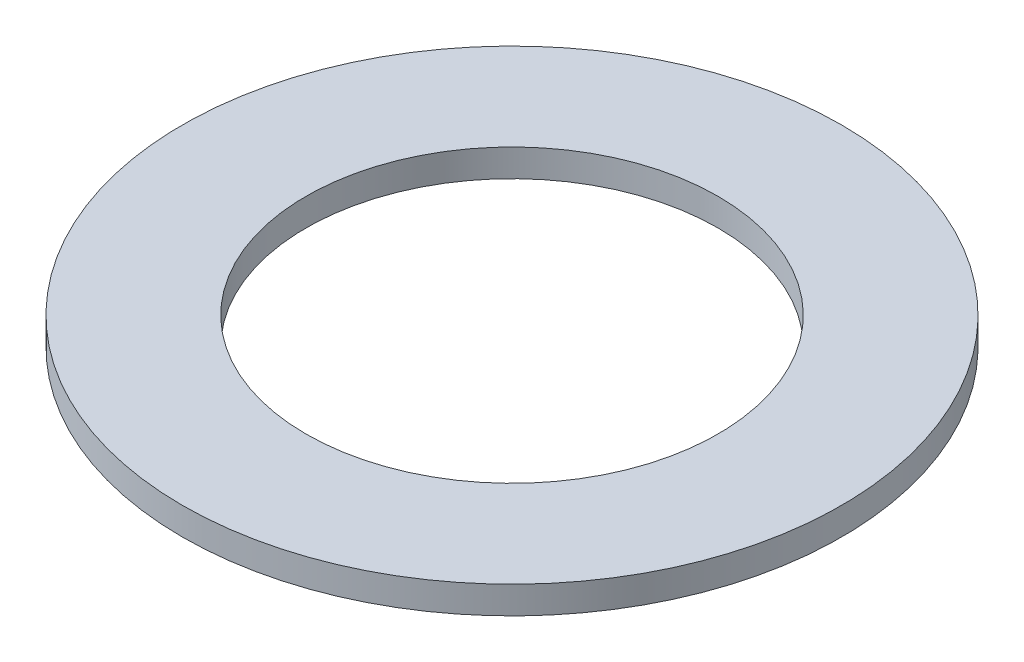
ISO-10303-21;
HEADER;
FILE_DESCRIPTION(('STEP AP214'),'2;1');
FILE_NAME('part.step','',(''),(''),'','','');
FILE_SCHEMA(('AUTOMOTIVE_DESIGN { 1 0 10303 214 1 1 1 1 }'));
ENDSEC;
DATA;
#1=APPLICATION_CONTEXT('core data for automotive mechanical design processes');
#2=APPLICATION_PROTOCOL_DEFINITION('international standard','automotive_design',2000,#1);
#3=PRODUCT_CONTEXT('',#1,'mechanical');
#4=PRODUCT('Part','Part','',(#3));
#5=PRODUCT_RELATED_PRODUCT_CATEGORY('part','',(#4));
#6=PRODUCT_DEFINITION_FORMATION('','',#4);
#7=PRODUCT_DEFINITION_CONTEXT('part definition',#1,'design');
#8=PRODUCT_DEFINITION('design','',#6,#7);
#9=PRODUCT_DEFINITION_SHAPE('','',#8);
#10=(LENGTH_UNIT() NAMED_UNIT(*) SI_UNIT(.MILLI.,.METRE.));
#11=(NAMED_UNIT(*) PLANE_ANGLE_UNIT() SI_UNIT($,.RADIAN.));
#12=(NAMED_UNIT(*) SI_UNIT($,.STERADIAN.) SOLID_ANGLE_UNIT());
#13=UNCERTAINTY_MEASURE_WITH_UNIT(LENGTH_MEASURE(1.E-05),#10,'distance_accuracy_value','');
#14=(GEOMETRIC_REPRESENTATION_CONTEXT(3) GLOBAL_UNCERTAINTY_ASSIGNED_CONTEXT((#13)) GLOBAL_UNIT_ASSIGNED_CONTEXT((#10,
#11,#12)) REPRESENTATION_CONTEXT('',''));
#15=CARTESIAN_POINT('',(0.,0.,0.));
#16=DIRECTION('',(0.,0.,1.));
#17=DIRECTION('',(1.,0.,0.));
#18=AXIS2_PLACEMENT_3D('',#15,#16,#17);
#19=CARTESIAN_POINT('',(0.,0.5,0.));
#20=DIRECTION('',(0.,1.,0.));
#21=DIRECTION('',(0.,0.,1.));
#22=AXIS2_PLACEMENT_3D('',#19,#20,#21);
#23=PLANE('',#22);
#24=CARTESIAN_POINT('',(0.,0.5,0.));
#25=DIRECTION('',(0.,1.,0.));
#26=DIRECTION('',(0.,0.,1.));
#27=AXIS2_PLACEMENT_3D('',#24,#25,#26);
#28=CIRCLE('',#27,6.);
#29=CARTESIAN_POINT('',(0.,0.5,6.));
#30=VERTEX_POINT('',#29);
#31=EDGE_CURVE('E10',#30,#30,#28,.T.);
#32=ORIENTED_EDGE('',*,*,#31,.T.);
#33=EDGE_LOOP('',(#32));
#34=FACE_BOUND('',#33,.T.);
#35=CARTESIAN_POINT('',(0.,0.5,0.));
#36=DIRECTION('',(0.,1.,0.));
#37=DIRECTION('',(0.,0.,1.));
#38=AXIS2_PLACEMENT_3D('',#35,#36,#37);
#39=CIRCLE('',#38,3.75);
#40=CARTESIAN_POINT('',(0.,0.5,3.75));
#41=VERTEX_POINT('',#40);
#42=EDGE_CURVE('E43',#41,#41,#39,.T.);
#43=ORIENTED_EDGE('',*,*,#42,.F.);
#44=EDGE_LOOP('',(#43));
#45=FACE_BOUND('',#44,.T.);
#46=ADVANCED_FACE('F32',(#34,#45),#23,.T.);
#47=CARTESIAN_POINT('',(0.,0.,0.));
#48=DIRECTION('',(0.,1.,0.));
#49=DIRECTION('',(0.,0.,1.));
#50=AXIS2_PLACEMENT_3D('',#47,#48,#49);
#51=PLANE('',#50);
#52=CARTESIAN_POINT('',(0.,0.,0.));
#53=DIRECTION('',(0.,1.,0.));
#54=DIRECTION('',(0.,0.,1.));
#55=AXIS2_PLACEMENT_3D('',#52,#53,#54);
#56=CIRCLE('',#55,6.);
#57=CARTESIAN_POINT('',(0.,0.,6.));
#58=VERTEX_POINT('',#57);
#59=EDGE_CURVE('E36',#58,#58,#56,.T.);
#60=ORIENTED_EDGE('',*,*,#59,.F.);
#61=EDGE_LOOP('',(#60));
#62=FACE_BOUND('',#61,.T.);
#63=CARTESIAN_POINT('',(0.,0.,0.));
#64=DIRECTION('',(0.,1.,0.));
#65=DIRECTION('',(0.,0.,1.));
#66=AXIS2_PLACEMENT_3D('',#63,#64,#65);
#67=CIRCLE('',#66,3.75);
#68=CARTESIAN_POINT('',(0.,0.,3.75));
#69=VERTEX_POINT('',#68);
#70=EDGE_CURVE('E45',#69,#69,#67,.T.);
#71=ORIENTED_EDGE('',*,*,#70,.T.);
#72=EDGE_LOOP('',(#71));
#73=FACE_BOUND('',#72,.T.);
#74=ADVANCED_FACE('F55',(#62,#73),#51,.F.);
#75=CARTESIAN_POINT('',(0.,0.5,0.));
#76=DIRECTION('',(0.,-1.,0.));
#77=DIRECTION('',(0.,0.,-1.));
#78=AXIS2_PLACEMENT_3D('',#75,#76,#77);
#79=CYLINDRICAL_SURFACE('',#78,6.);
#80=ORIENTED_EDGE('',*,*,#31,.F.);
#81=EDGE_LOOP('',(#80));
#82=FACE_BOUND('',#81,.T.);
#83=ORIENTED_EDGE('',*,*,#59,.T.);
#84=EDGE_LOOP('',(#83));
#85=FACE_BOUND('',#84,.T.);
#86=ADVANCED_FACE('F34',(#82,#85),#79,.T.);
#87=CARTESIAN_POINT('',(0.,0.5,0.));
#88=DIRECTION('',(0.,-1.,0.));
#89=DIRECTION('',(0.,0.,-1.));
#90=AXIS2_PLACEMENT_3D('',#87,#88,#89);
#91=CYLINDRICAL_SURFACE('',#90,3.75);
#92=ORIENTED_EDGE('',*,*,#42,.T.);
#93=EDGE_LOOP('',(#92));
#94=FACE_BOUND('',#93,.T.);
#95=ORIENTED_EDGE('',*,*,#70,.F.);
#96=EDGE_LOOP('',(#95));
#97=FACE_BOUND('',#96,.T.);
#98=ADVANCED_FACE('F51',(#94,#97),#91,.F.);
#99=CLOSED_SHELL('',(#46,#74,#86,#98));
#100=MANIFOLD_SOLID_BREP('B2',#99);
#101=ADVANCED_BREP_SHAPE_REPRESENTATION('',(#18,#100),#14);
#102=SHAPE_DEFINITION_REPRESENTATION(#9,#101);
ENDSEC;
END-ISO-10303-21;
